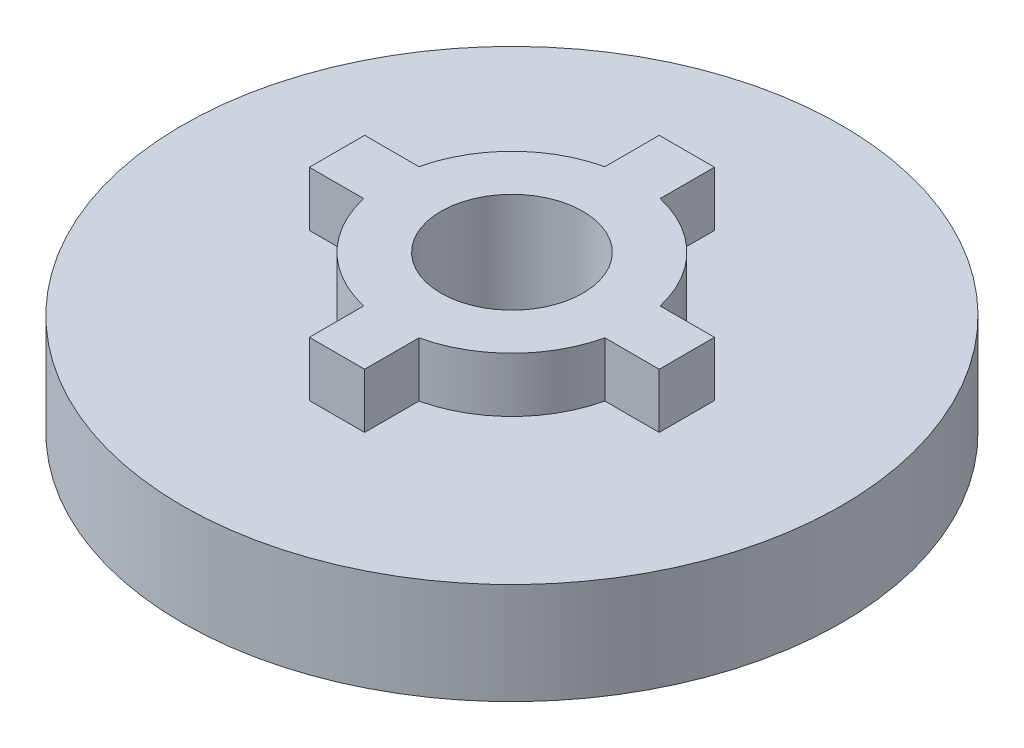
ISO-10303-21;
HEADER;
FILE_DESCRIPTION(('STEP AP214'),'2;1');
FILE_NAME('part.step','',(''),(''),'','','');
FILE_SCHEMA(('AUTOMOTIVE_DESIGN { 1 0 10303 214 1 1 1 1 }'));
ENDSEC;
DATA;
#1=APPLICATION_CONTEXT('core data for automotive mechanical design processes');
#2=APPLICATION_PROTOCOL_DEFINITION('international standard','automotive_design',2000,#1);
#3=PRODUCT_CONTEXT('',#1,'mechanical');
#4=PRODUCT('Part','Part','',(#3));
#5=PRODUCT_RELATED_PRODUCT_CATEGORY('part','',(#4));
#6=PRODUCT_DEFINITION_FORMATION('','',#4);
#7=PRODUCT_DEFINITION_CONTEXT('part definition',#1,'design');
#8=PRODUCT_DEFINITION('design','',#6,#7);
#9=PRODUCT_DEFINITION_SHAPE('','',#8);
#10=(LENGTH_UNIT() NAMED_UNIT(*) SI_UNIT(.MILLI.,.METRE.));
#11=(NAMED_UNIT(*) PLANE_ANGLE_UNIT() SI_UNIT($,.RADIAN.));
#12=(NAMED_UNIT(*) SI_UNIT($,.STERADIAN.) SOLID_ANGLE_UNIT());
#13=UNCERTAINTY_MEASURE_WITH_UNIT(LENGTH_MEASURE(1.E-05),#10,'distance_accuracy_value','');
#14=(GEOMETRIC_REPRESENTATION_CONTEXT(3) GLOBAL_UNCERTAINTY_ASSIGNED_CONTEXT((#13)) GLOBAL_UNIT_ASSIGNED_CONTEXT((#10,
#11,#12)) REPRESENTATION_CONTEXT('',''));
#15=CARTESIAN_POINT('',(0.,0.,0.));
#16=DIRECTION('',(0.,0.,1.));
#17=DIRECTION('',(1.,0.,0.));
#18=AXIS2_PLACEMENT_3D('',#15,#16,#17);
#19=CARTESIAN_POINT('',(0.,10.,0.));
#20=DIRECTION('',(0.,-1.,0.));
#21=DIRECTION('',(0.,0.,-1.));
#22=AXIS2_PLACEMENT_3D('',#19,#20,#21);
#23=CYLINDRICAL_SURFACE('',#22,32.5);
#24=CARTESIAN_POINT('',(0.,10.,0.));
#25=DIRECTION('',(0.,1.,0.));
#26=DIRECTION('',(0.,0.,1.));
#27=AXIS2_PLACEMENT_3D('',#24,#25,#26);
#28=CIRCLE('',#27,32.5);
#29=CARTESIAN_POINT('',(0.,10.,32.5));
#30=VERTEX_POINT('',#29);
#31=EDGE_CURVE('E11',#30,#30,#28,.T.);
#32=ORIENTED_EDGE('',*,*,#31,.F.);
#33=EDGE_LOOP('',(#32));
#34=FACE_BOUND('',#33,.T.);
#35=CARTESIAN_POINT('',(0.,0.,0.));
#36=DIRECTION('',(0.,1.,0.));
#37=DIRECTION('',(0.,0.,1.));
#38=AXIS2_PLACEMENT_3D('',#35,#36,#37);
#39=CIRCLE('',#38,32.5);
#40=CARTESIAN_POINT('',(0.,0.,32.5));
#41=VERTEX_POINT('',#40);
#42=EDGE_CURVE('E48',#41,#41,#39,.T.);
#43=ORIENTED_EDGE('',*,*,#42,.T.);
#44=EDGE_LOOP('',(#43));
#45=FACE_BOUND('',#44,.T.);
#46=ADVANCED_FACE('F45',(#34,#45),#23,.T.);
#47=CARTESIAN_POINT('',(0.,10.,0.));
#48=DIRECTION('',(0.,1.,0.));
#49=DIRECTION('',(0.,0.,1.));
#50=AXIS2_PLACEMENT_3D('',#47,#48,#49);
#51=PLANE('',#50);
#52=DIRECTION('',(1.,0.,0.));
#53=VECTOR('',#52,1.);
#54=CARTESIAN_POINT('',(11.8917776215333,10.,2.725));
#55=LINE('',#54,#53);
#56=CARTESIAN_POINT('',(11.8917776215333,10.,2.725));
#57=VERTEX_POINT('',#56);
#58=CARTESIAN_POINT('',(17.25,10.,2.725));
#59=VERTEX_POINT('',#58);
#60=EDGE_CURVE('E60',#57,#59,#55,.T.);
#61=ORIENTED_EDGE('',*,*,#60,.F.);
#62=CARTESIAN_POINT('',(0.,10.,0.));
#63=DIRECTION('',(0.,1.,0.));
#64=DIRECTION('',(0.,0.,1.));
#65=AXIS2_PLACEMENT_3D('',#62,#63,#64);
#66=CIRCLE('',#65,12.2);
#67=CARTESIAN_POINT('',(2.725,10.,11.8917776215333));
#68=VERTEX_POINT('',#67);
#69=EDGE_CURVE('E64',#68,#57,#66,.T.);
#70=ORIENTED_EDGE('',*,*,#69,.F.);
#71=DIRECTION('',(0.,0.,-1.));
#72=VECTOR('',#71,1.);
#73=CARTESIAN_POINT('',(2.725,10.,17.25));
#74=LINE('',#73,#72);
#75=CARTESIAN_POINT('',(2.725,10.,17.25));
#76=VERTEX_POINT('',#75);
#77=EDGE_CURVE('E244',#76,#68,#74,.T.);
#78=ORIENTED_EDGE('',*,*,#77,.F.);
#79=DIRECTION('',(1.,0.,0.));
#80=VECTOR('',#79,1.);
#81=CARTESIAN_POINT('',(-2.725,10.,17.25));
#82=LINE('',#81,#80);
#83=CARTESIAN_POINT('',(-2.725,10.,17.25));
#84=VERTEX_POINT('',#83);
#85=EDGE_CURVE('E247',#84,#76,#82,.T.);
#86=ORIENTED_EDGE('',*,*,#85,.F.);
#87=DIRECTION('',(0.,0.,1.));
#88=VECTOR('',#87,1.);
#89=CARTESIAN_POINT('',(-2.725,10.,17.25));
#90=LINE('',#89,#88);
#91=CARTESIAN_POINT('',(-2.725,10.,11.8917776215333));
#92=VERTEX_POINT('',#91);
#93=EDGE_CURVE('E251',#92,#84,#90,.T.);
#94=ORIENTED_EDGE('',*,*,#93,.F.);
#95=CARTESIAN_POINT('',(0.,10.,0.));
#96=DIRECTION('',(0.,1.,0.));
#97=DIRECTION('',(0.,0.,1.));
#98=AXIS2_PLACEMENT_3D('',#95,#96,#97);
#99=CIRCLE('',#98,12.2);
#100=CARTESIAN_POINT('',(-11.8917776215333,10.,2.725));
#101=VERTEX_POINT('',#100);
#102=EDGE_CURVE('E255',#101,#92,#99,.T.);
#103=ORIENTED_EDGE('',*,*,#102,.F.);
#104=DIRECTION('',(1.,0.,0.));
#105=VECTOR('',#104,1.);
#106=CARTESIAN_POINT('',(-17.25,10.,2.725));
#107=LINE('',#106,#105);
#108=CARTESIAN_POINT('',(-17.25,10.,2.725));
#109=VERTEX_POINT('',#108);
#110=EDGE_CURVE('E259',#109,#101,#107,.T.);
#111=ORIENTED_EDGE('',*,*,#110,.F.);
#112=DIRECTION('',(0.,0.,1.));
#113=VECTOR('',#112,1.);
#114=CARTESIAN_POINT('',(-17.25,10.,-2.725));
#115=LINE('',#114,#113);
#116=CARTESIAN_POINT('',(-17.25,10.,-2.725));
#117=VERTEX_POINT('',#116);
#118=EDGE_CURVE('E263',#117,#109,#115,.T.);
#119=ORIENTED_EDGE('',*,*,#118,.F.);
#120=DIRECTION('',(-1.,0.,0.));
#121=VECTOR('',#120,1.);
#122=CARTESIAN_POINT('',(-17.25,10.,-2.725));
#123=LINE('',#122,#121);
#124=CARTESIAN_POINT('',(-11.8917776215333,10.,-2.725));
#125=VERTEX_POINT('',#124);
#126=EDGE_CURVE('E267',#125,#117,#123,.T.);
#127=ORIENTED_EDGE('',*,*,#126,.F.);
#128=CARTESIAN_POINT('',(0.,10.,0.));
#129=DIRECTION('',(0.,1.,0.));
#130=DIRECTION('',(0.,0.,1.));
#131=AXIS2_PLACEMENT_3D('',#128,#129,#130);
#132=CIRCLE('',#131,12.2);
#133=CARTESIAN_POINT('',(-2.725,10.,-11.8917776215333));
#134=VERTEX_POINT('',#133);
#135=EDGE_CURVE('E271',#134,#125,#132,.T.);
#136=ORIENTED_EDGE('',*,*,#135,.F.);
#137=DIRECTION('',(0.,0.,1.));
#138=VECTOR('',#137,1.);
#139=CARTESIAN_POINT('',(-2.725,10.,-11.8917776215333));
#140=LINE('',#139,#138);
#141=CARTESIAN_POINT('',(-2.725,10.,-17.25));
#142=VERTEX_POINT('',#141);
#143=EDGE_CURVE('E275',#142,#134,#140,.T.);
#144=ORIENTED_EDGE('',*,*,#143,.F.);
#145=DIRECTION('',(-1.,0.,0.));
#146=VECTOR('',#145,1.);
#147=CARTESIAN_POINT('',(-2.725,10.,-17.25));
#148=LINE('',#147,#146);
#149=CARTESIAN_POINT('',(2.725,10.,-17.25));
#150=VERTEX_POINT('',#149);
#151=EDGE_CURVE('E279',#150,#142,#148,.T.);
#152=ORIENTED_EDGE('',*,*,#151,.F.);
#153=DIRECTION('',(0.,0.,-1.));
#154=VECTOR('',#153,1.);
#155=CARTESIAN_POINT('',(2.725,10.,-11.8917776215333));
#156=LINE('',#155,#154);
#157=CARTESIAN_POINT('',(2.725,10.,-11.8917776215333));
#158=VERTEX_POINT('',#157);
#159=EDGE_CURVE('E283',#158,#150,#156,.T.);
#160=ORIENTED_EDGE('',*,*,#159,.F.);
#161=CARTESIAN_POINT('',(0.,10.,0.));
#162=DIRECTION('',(0.,1.,0.));
#163=DIRECTION('',(0.,0.,1.));
#164=AXIS2_PLACEMENT_3D('',#161,#162,#163);
#165=CIRCLE('',#164,12.2);
#166=CARTESIAN_POINT('',(11.8917776215333,10.,-2.725));
#167=VERTEX_POINT('',#166);
#168=EDGE_CURVE('E287',#167,#158,#165,.T.);
#169=ORIENTED_EDGE('',*,*,#168,.F.);
#170=DIRECTION('',(-1.,0.,0.));
#171=VECTOR('',#170,1.);
#172=CARTESIAN_POINT('',(11.8917776215333,10.,-2.725));
#173=LINE('',#172,#171);
#174=CARTESIAN_POINT('',(17.25,10.,-2.725));
#175=VERTEX_POINT('',#174);
#176=EDGE_CURVE('E291',#175,#167,#173,.T.);
#177=ORIENTED_EDGE('',*,*,#176,.F.);
#178=DIRECTION('',(0.,0.,-1.));
#179=VECTOR('',#178,1.);
#180=CARTESIAN_POINT('',(17.25,10.,-2.725));
#181=LINE('',#180,#179);
#182=EDGE_CURVE('E295',#59,#175,#181,.T.);
#183=ORIENTED_EDGE('',*,*,#182,.F.);
#184=EDGE_LOOP('',(#61,#70,#78,#86,#94,#103,#111,#119,#127,#136,#144,#152,#160,#169,#177,#183));
#185=FACE_BOUND('',#184,.T.);
#186=ORIENTED_EDGE('',*,*,#31,.T.);
#187=EDGE_LOOP('',(#186));
#188=FACE_BOUND('',#187,.T.);
#189=ADVANCED_FACE('F369',(#185,#188),#51,.T.);
#190=CARTESIAN_POINT('',(0.,0.,0.));
#191=DIRECTION('',(0.,1.,0.));
#192=DIRECTION('',(0.,0.,1.));
#193=AXIS2_PLACEMENT_3D('',#190,#191,#192);
#194=PLANE('',#193);
#195=CARTESIAN_POINT('',(0.,0.,0.));
#196=DIRECTION('',(0.,1.,0.));
#197=DIRECTION('',(0.,0.,1.));
#198=AXIS2_PLACEMENT_3D('',#195,#196,#197);
#199=CIRCLE('',#198,7.);
#200=CARTESIAN_POINT('',(0.,0.,7.));
#201=VERTEX_POINT('',#200);
#202=EDGE_CURVE('E300',#201,#201,#199,.T.);
#203=ORIENTED_EDGE('',*,*,#202,.T.);
#204=EDGE_LOOP('',(#203));
#205=FACE_BOUND('',#204,.T.);
#206=ORIENTED_EDGE('',*,*,#42,.F.);
#207=EDGE_LOOP('',(#206));
#208=FACE_BOUND('',#207,.T.);
#209=ADVANCED_FACE('F349',(#205,#208),#194,.F.);
#210=CARTESIAN_POINT('',(11.8917776215333,15.4,2.725));
#211=DIRECTION('',(0.,0.,-1.));
#212=DIRECTION('',(-1.,0.,0.));
#213=AXIS2_PLACEMENT_3D('',#210,#211,#212);
#214=PLANE('',#213);
#215=ORIENTED_EDGE('',*,*,#60,.T.);
#216=DIRECTION('',(0.,-1.,0.));
#217=VECTOR('',#216,1.);
#218=CARTESIAN_POINT('',(17.25,15.4,2.725));
#219=LINE('',#218,#217);
#220=CARTESIAN_POINT('',(17.25,15.4,2.725));
#221=VERTEX_POINT('',#220);
#222=EDGE_CURVE('E161',#221,#59,#219,.T.);
#223=ORIENTED_EDGE('',*,*,#222,.F.);
#224=DIRECTION('',(1.,0.,0.));
#225=VECTOR('',#224,1.);
#226=CARTESIAN_POINT('',(11.8917776215333,15.4,2.725));
#227=LINE('',#226,#225);
#228=CARTESIAN_POINT('',(11.8917776215333,15.4,2.725));
#229=VERTEX_POINT('',#228);
#230=EDGE_CURVE('E168',#229,#221,#227,.T.);
#231=ORIENTED_EDGE('',*,*,#230,.F.);
#232=DIRECTION('',(0.,-1.,0.));
#233=VECTOR('',#232,1.);
#234=CARTESIAN_POINT('',(11.8917776215333,15.4,2.725));
#235=LINE('',#234,#233);
#236=EDGE_CURVE('E239',#229,#57,#235,.T.);
#237=ORIENTED_EDGE('',*,*,#236,.T.);
#238=EDGE_LOOP('',(#215,#223,#231,#237));
#239=FACE_BOUND('',#238,.T.);
#240=ADVANCED_FACE('F179',(#239),#214,.F.);
#241=CARTESIAN_POINT('',(17.25,15.4,-2.725));
#242=DIRECTION('',(-1.,0.,0.));
#243=DIRECTION('',(0.,0.,1.));
#244=AXIS2_PLACEMENT_3D('',#241,#242,#243);
#245=PLANE('',#244);
#246=ORIENTED_EDGE('',*,*,#182,.T.);
#247=DIRECTION('',(0.,-1.,0.));
#248=VECTOR('',#247,1.);
#249=CARTESIAN_POINT('',(17.25,15.4,-2.725));
#250=LINE('',#249,#248);
#251=CARTESIAN_POINT('',(17.25,15.4,-2.725));
#252=VERTEX_POINT('',#251);
#253=EDGE_CURVE('E163',#252,#175,#250,.T.);
#254=ORIENTED_EDGE('',*,*,#253,.F.);
#255=DIRECTION('',(0.,0.,-1.));
#256=VECTOR('',#255,1.);
#257=CARTESIAN_POINT('',(17.25,15.4,-2.725));
#258=LINE('',#257,#256);
#259=EDGE_CURVE('E156',#221,#252,#258,.T.);
#260=ORIENTED_EDGE('',*,*,#259,.F.);
#261=ORIENTED_EDGE('',*,*,#222,.T.);
#262=EDGE_LOOP('',(#246,#254,#260,#261));
#263=FACE_BOUND('',#262,.T.);
#264=ADVANCED_FACE('F159',(#263),#245,.F.);
#265=CARTESIAN_POINT('',(11.8917776215333,15.4,-2.725));
#266=DIRECTION('',(0.,0.,1.));
#267=DIRECTION('',(1.,0.,0.));
#268=AXIS2_PLACEMENT_3D('',#265,#266,#267);
#269=PLANE('',#268);
#270=ORIENTED_EDGE('',*,*,#176,.T.);
#271=DIRECTION('',(0.,-1.,0.));
#272=VECTOR('',#271,1.);
#273=CARTESIAN_POINT('',(11.8917776215333,15.4,-2.725));
#274=LINE('',#273,#272);
#275=CARTESIAN_POINT('',(11.8917776215333,15.4,-2.725));
#276=VERTEX_POINT('',#275);
#277=EDGE_CURVE('E185',#276,#167,#274,.T.);
#278=ORIENTED_EDGE('',*,*,#277,.F.);
#279=DIRECTION('',(-1.,0.,0.));
#280=VECTOR('',#279,1.);
#281=CARTESIAN_POINT('',(11.8917776215333,15.4,-2.725));
#282=LINE('',#281,#280);
#283=EDGE_CURVE('E167',#252,#276,#282,.T.);
#284=ORIENTED_EDGE('',*,*,#283,.F.);
#285=ORIENTED_EDGE('',*,*,#253,.T.);
#286=EDGE_LOOP('',(#270,#278,#284,#285));
#287=FACE_BOUND('',#286,.T.);
#288=ADVANCED_FACE('F385',(#287),#269,.F.);
#289=CARTESIAN_POINT('',(0.,15.4,0.));
#290=DIRECTION('',(0.,-1.,0.));
#291=DIRECTION('',(0.,0.,-1.));
#292=AXIS2_PLACEMENT_3D('',#289,#290,#291);
#293=CYLINDRICAL_SURFACE('',#292,12.2);
#294=ORIENTED_EDGE('',*,*,#168,.T.);
#295=DIRECTION('',(0.,-1.,0.));
#296=VECTOR('',#295,1.);
#297=CARTESIAN_POINT('',(2.725,15.4,-11.8917776215333));
#298=LINE('',#297,#296);
#299=CARTESIAN_POINT('',(2.725,15.4,-11.8917776215333));
#300=VERTEX_POINT('',#299);
#301=EDGE_CURVE('E191',#300,#158,#298,.T.);
#302=ORIENTED_EDGE('',*,*,#301,.F.);
#303=CARTESIAN_POINT('',(0.,15.4,0.));
#304=DIRECTION('',(0.,1.,0.));
#305=DIRECTION('',(0.,0.,1.));
#306=AXIS2_PLACEMENT_3D('',#303,#304,#305);
#307=CIRCLE('',#306,12.2);
#308=EDGE_CURVE('E336',#276,#300,#307,.T.);
#309=ORIENTED_EDGE('',*,*,#308,.F.);
#310=ORIENTED_EDGE('',*,*,#277,.T.);
#311=EDGE_LOOP('',(#294,#302,#309,#310));
#312=FACE_BOUND('',#311,.T.);
#313=ADVANCED_FACE('F388',(#312),#293,.T.);
#314=CARTESIAN_POINT('',(2.725,15.4,-11.8917776215333));
#315=DIRECTION('',(-1.,0.,0.));
#316=DIRECTION('',(0.,0.,1.));
#317=AXIS2_PLACEMENT_3D('',#314,#315,#316);
#318=PLANE('',#317);
#319=ORIENTED_EDGE('',*,*,#159,.T.);
#320=DIRECTION('',(0.,-1.,0.));
#321=VECTOR('',#320,1.);
#322=CARTESIAN_POINT('',(2.725,15.4,-17.25));
#323=LINE('',#322,#321);
#324=CARTESIAN_POINT('',(2.725,15.4,-17.25));
#325=VERTEX_POINT('',#324);
#326=EDGE_CURVE('E195',#325,#150,#323,.T.);
#327=ORIENTED_EDGE('',*,*,#326,.F.);
#328=DIRECTION('',(0.,0.,-1.));
#329=VECTOR('',#328,1.);
#330=CARTESIAN_POINT('',(2.725,15.4,-11.8917776215333));
#331=LINE('',#330,#329);
#332=EDGE_CURVE('E333',#300,#325,#331,.T.);
#333=ORIENTED_EDGE('',*,*,#332,.F.);
#334=ORIENTED_EDGE('',*,*,#301,.T.);
#335=EDGE_LOOP('',(#319,#327,#333,#334));
#336=FACE_BOUND('',#335,.T.);
#337=ADVANCED_FACE('F392',(#336),#318,.F.);
#338=CARTESIAN_POINT('',(-2.725,15.4,-17.25));
#339=DIRECTION('',(0.,0.,1.));
#340=DIRECTION('',(1.,0.,0.));
#341=AXIS2_PLACEMENT_3D('',#338,#339,#340);
#342=PLANE('',#341);
#343=ORIENTED_EDGE('',*,*,#151,.T.);
#344=DIRECTION('',(0.,-1.,0.));
#345=VECTOR('',#344,1.);
#346=CARTESIAN_POINT('',(-2.725,15.4,-17.25));
#347=LINE('',#346,#345);
#348=CARTESIAN_POINT('',(-2.725,15.4,-17.25));
#349=VERTEX_POINT('',#348);
#350=EDGE_CURVE('E199',#349,#142,#347,.T.);
#351=ORIENTED_EDGE('',*,*,#350,.F.);
#352=DIRECTION('',(-1.,0.,0.));
#353=VECTOR('',#352,1.);
#354=CARTESIAN_POINT('',(-2.725,15.4,-17.25));
#355=LINE('',#354,#353);
#356=EDGE_CURVE('E330',#325,#349,#355,.T.);
#357=ORIENTED_EDGE('',*,*,#356,.F.);
#358=ORIENTED_EDGE('',*,*,#326,.T.);
#359=EDGE_LOOP('',(#343,#351,#357,#358));
#360=FACE_BOUND('',#359,.T.);
#361=ADVANCED_FACE('F396',(#360),#342,.F.);
#362=CARTESIAN_POINT('',(-2.725,15.4,-11.8917776215333));
#363=DIRECTION('',(1.,0.,0.));
#364=DIRECTION('',(0.,0.,-1.));
#365=AXIS2_PLACEMENT_3D('',#362,#363,#364);
#366=PLANE('',#365);
#367=ORIENTED_EDGE('',*,*,#143,.T.);
#368=DIRECTION('',(0.,-1.,0.));
#369=VECTOR('',#368,1.);
#370=CARTESIAN_POINT('',(-2.725,15.4,-11.8917776215333));
#371=LINE('',#370,#369);
#372=CARTESIAN_POINT('',(-2.725,15.4,-11.8917776215333));
#373=VERTEX_POINT('',#372);
#374=EDGE_CURVE('E203',#373,#134,#371,.T.);
#375=ORIENTED_EDGE('',*,*,#374,.F.);
#376=DIRECTION('',(0.,0.,1.));
#377=VECTOR('',#376,1.);
#378=CARTESIAN_POINT('',(-2.725,15.4,-11.8917776215333));
#379=LINE('',#378,#377);
#380=EDGE_CURVE('E327',#349,#373,#379,.T.);
#381=ORIENTED_EDGE('',*,*,#380,.F.);
#382=ORIENTED_EDGE('',*,*,#350,.T.);
#383=EDGE_LOOP('',(#367,#375,#381,#382));
#384=FACE_BOUND('',#383,.T.);
#385=ADVANCED_FACE('F400',(#384),#366,.F.);
#386=CARTESIAN_POINT('',(0.,15.4,0.));
#387=DIRECTION('',(0.,-1.,0.));
#388=DIRECTION('',(0.,0.,-1.));
#389=AXIS2_PLACEMENT_3D('',#386,#387,#388);
#390=CYLINDRICAL_SURFACE('',#389,12.2);
#391=ORIENTED_EDGE('',*,*,#135,.T.);
#392=DIRECTION('',(0.,-1.,0.));
#393=VECTOR('',#392,1.);
#394=CARTESIAN_POINT('',(-11.8917776215333,15.4,-2.725));
#395=LINE('',#394,#393);
#396=CARTESIAN_POINT('',(-11.8917776215333,15.4,-2.725));
#397=VERTEX_POINT('',#396);
#398=EDGE_CURVE('E207',#397,#125,#395,.T.);
#399=ORIENTED_EDGE('',*,*,#398,.F.);
#400=CARTESIAN_POINT('',(0.,15.4,0.));
#401=DIRECTION('',(0.,1.,0.));
#402=DIRECTION('',(0.,0.,1.));
#403=AXIS2_PLACEMENT_3D('',#400,#401,#402);
#404=CIRCLE('',#403,12.2);
#405=EDGE_CURVE('E324',#373,#397,#404,.T.);
#406=ORIENTED_EDGE('',*,*,#405,.F.);
#407=ORIENTED_EDGE('',*,*,#374,.T.);
#408=EDGE_LOOP('',(#391,#399,#406,#407));
#409=FACE_BOUND('',#408,.T.);
#410=ADVANCED_FACE('F404',(#409),#390,.T.);
#411=CARTESIAN_POINT('',(-17.25,15.4,-2.725));
#412=DIRECTION('',(0.,0.,1.));
#413=DIRECTION('',(1.,0.,0.));
#414=AXIS2_PLACEMENT_3D('',#411,#412,#413);
#415=PLANE('',#414);
#416=ORIENTED_EDGE('',*,*,#126,.T.);
#417=DIRECTION('',(0.,-1.,0.));
#418=VECTOR('',#417,1.);
#419=CARTESIAN_POINT('',(-17.25,15.4,-2.725));
#420=LINE('',#419,#418);
#421=CARTESIAN_POINT('',(-17.25,15.4,-2.725));
#422=VERTEX_POINT('',#421);
#423=EDGE_CURVE('E211',#422,#117,#420,.T.);
#424=ORIENTED_EDGE('',*,*,#423,.F.);
#425=DIRECTION('',(-1.,0.,0.));
#426=VECTOR('',#425,1.);
#427=CARTESIAN_POINT('',(-17.25,15.4,-2.725));
#428=LINE('',#427,#426);
#429=EDGE_CURVE('E321',#397,#422,#428,.T.);
#430=ORIENTED_EDGE('',*,*,#429,.F.);
#431=ORIENTED_EDGE('',*,*,#398,.T.);
#432=EDGE_LOOP('',(#416,#424,#430,#431));
#433=FACE_BOUND('',#432,.T.);
#434=ADVANCED_FACE('F408',(#433),#415,.F.);
#435=CARTESIAN_POINT('',(-17.25,15.4,-2.725));
#436=DIRECTION('',(1.,0.,0.));
#437=DIRECTION('',(0.,0.,-1.));
#438=AXIS2_PLACEMENT_3D('',#435,#436,#437);
#439=PLANE('',#438);
#440=ORIENTED_EDGE('',*,*,#118,.T.);
#441=DIRECTION('',(0.,-1.,0.));
#442=VECTOR('',#441,1.);
#443=CARTESIAN_POINT('',(-17.25,15.4,2.725));
#444=LINE('',#443,#442);
#445=CARTESIAN_POINT('',(-17.25,15.4,2.725));
#446=VERTEX_POINT('',#445);
#447=EDGE_CURVE('E215',#446,#109,#444,.T.);
#448=ORIENTED_EDGE('',*,*,#447,.F.);
#449=DIRECTION('',(0.,0.,1.));
#450=VECTOR('',#449,1.);
#451=CARTESIAN_POINT('',(-17.25,15.4,-2.725));
#452=LINE('',#451,#450);
#453=EDGE_CURVE('E318',#422,#446,#452,.T.);
#454=ORIENTED_EDGE('',*,*,#453,.F.);
#455=ORIENTED_EDGE('',*,*,#423,.T.);
#456=EDGE_LOOP('',(#440,#448,#454,#455));
#457=FACE_BOUND('',#456,.T.);
#458=ADVANCED_FACE('F412',(#457),#439,.F.);
#459=CARTESIAN_POINT('',(-17.25,15.4,2.725));
#460=DIRECTION('',(0.,0.,-1.));
#461=DIRECTION('',(-1.,0.,0.));
#462=AXIS2_PLACEMENT_3D('',#459,#460,#461);
#463=PLANE('',#462);
#464=ORIENTED_EDGE('',*,*,#110,.T.);
#465=DIRECTION('',(0.,-1.,0.));
#466=VECTOR('',#465,1.);
#467=CARTESIAN_POINT('',(-11.8917776215333,15.4,2.725));
#468=LINE('',#467,#466);
#469=CARTESIAN_POINT('',(-11.8917776215333,15.4,2.725));
#470=VERTEX_POINT('',#469);
#471=EDGE_CURVE('E219',#470,#101,#468,.T.);
#472=ORIENTED_EDGE('',*,*,#471,.F.);
#473=DIRECTION('',(1.,0.,0.));
#474=VECTOR('',#473,1.);
#475=CARTESIAN_POINT('',(-17.25,15.4,2.725));
#476=LINE('',#475,#474);
#477=EDGE_CURVE('E315',#446,#470,#476,.T.);
#478=ORIENTED_EDGE('',*,*,#477,.F.);
#479=ORIENTED_EDGE('',*,*,#447,.T.);
#480=EDGE_LOOP('',(#464,#472,#478,#479));
#481=FACE_BOUND('',#480,.T.);
#482=ADVANCED_FACE('F416',(#481),#463,.F.);
#483=CARTESIAN_POINT('',(0.,15.4,0.));
#484=DIRECTION('',(0.,-1.,0.));
#485=DIRECTION('',(0.,0.,-1.));
#486=AXIS2_PLACEMENT_3D('',#483,#484,#485);
#487=CYLINDRICAL_SURFACE('',#486,12.2);
#488=ORIENTED_EDGE('',*,*,#102,.T.);
#489=DIRECTION('',(0.,-1.,0.));
#490=VECTOR('',#489,1.);
#491=CARTESIAN_POINT('',(-2.725,15.4,11.8917776215333));
#492=LINE('',#491,#490);
#493=CARTESIAN_POINT('',(-2.725,15.4,11.8917776215333));
#494=VERTEX_POINT('',#493);
#495=EDGE_CURVE('E223',#494,#92,#492,.T.);
#496=ORIENTED_EDGE('',*,*,#495,.F.);
#497=CARTESIAN_POINT('',(0.,15.4,0.));
#498=DIRECTION('',(0.,1.,0.));
#499=DIRECTION('',(0.,0.,1.));
#500=AXIS2_PLACEMENT_3D('',#497,#498,#499);
#501=CIRCLE('',#500,12.2);
#502=EDGE_CURVE('E312',#470,#494,#501,.T.);
#503=ORIENTED_EDGE('',*,*,#502,.F.);
#504=ORIENTED_EDGE('',*,*,#471,.T.);
#505=EDGE_LOOP('',(#488,#496,#503,#504));
#506=FACE_BOUND('',#505,.T.);
#507=ADVANCED_FACE('F420',(#506),#487,.T.);
#508=CARTESIAN_POINT('',(-2.725,15.4,17.25));
#509=DIRECTION('',(1.,0.,0.));
#510=DIRECTION('',(0.,0.,-1.));
#511=AXIS2_PLACEMENT_3D('',#508,#509,#510);
#512=PLANE('',#511);
#513=ORIENTED_EDGE('',*,*,#93,.T.);
#514=DIRECTION('',(0.,-1.,0.));
#515=VECTOR('',#514,1.);
#516=CARTESIAN_POINT('',(-2.725,15.4,17.25));
#517=LINE('',#516,#515);
#518=CARTESIAN_POINT('',(-2.725,15.4,17.25));
#519=VERTEX_POINT('',#518);
#520=EDGE_CURVE('E227',#519,#84,#517,.T.);
#521=ORIENTED_EDGE('',*,*,#520,.F.);
#522=DIRECTION('',(0.,0.,1.));
#523=VECTOR('',#522,1.);
#524=CARTESIAN_POINT('',(-2.725,15.4,17.25));
#525=LINE('',#524,#523);
#526=EDGE_CURVE('E309',#494,#519,#525,.T.);
#527=ORIENTED_EDGE('',*,*,#526,.F.);
#528=ORIENTED_EDGE('',*,*,#495,.T.);
#529=EDGE_LOOP('',(#513,#521,#527,#528));
#530=FACE_BOUND('',#529,.T.);
#531=ADVANCED_FACE('F424',(#530),#512,.F.);
#532=CARTESIAN_POINT('',(-2.725,15.4,17.25));
#533=DIRECTION('',(0.,0.,-1.));
#534=DIRECTION('',(-1.,0.,0.));
#535=AXIS2_PLACEMENT_3D('',#532,#533,#534);
#536=PLANE('',#535);
#537=ORIENTED_EDGE('',*,*,#85,.T.);
#538=DIRECTION('',(0.,-1.,0.));
#539=VECTOR('',#538,1.);
#540=CARTESIAN_POINT('',(2.725,15.4,17.25));
#541=LINE('',#540,#539);
#542=CARTESIAN_POINT('',(2.725,15.4,17.25));
#543=VERTEX_POINT('',#542);
#544=EDGE_CURVE('E231',#543,#76,#541,.T.);
#545=ORIENTED_EDGE('',*,*,#544,.F.);
#546=DIRECTION('',(1.,0.,0.));
#547=VECTOR('',#546,1.);
#548=CARTESIAN_POINT('',(-2.725,15.4,17.25));
#549=LINE('',#548,#547);
#550=EDGE_CURVE('E306',#519,#543,#549,.T.);
#551=ORIENTED_EDGE('',*,*,#550,.F.);
#552=ORIENTED_EDGE('',*,*,#520,.T.);
#553=EDGE_LOOP('',(#537,#545,#551,#552));
#554=FACE_BOUND('',#553,.T.);
#555=ADVANCED_FACE('F428',(#554),#536,.F.);
#556=CARTESIAN_POINT('',(2.725,15.4,17.25));
#557=DIRECTION('',(-1.,0.,0.));
#558=DIRECTION('',(0.,0.,1.));
#559=AXIS2_PLACEMENT_3D('',#556,#557,#558);
#560=PLANE('',#559);
#561=ORIENTED_EDGE('',*,*,#77,.T.);
#562=DIRECTION('',(0.,-1.,0.));
#563=VECTOR('',#562,1.);
#564=CARTESIAN_POINT('',(2.725,15.4,11.8917776215333));
#565=LINE('',#564,#563);
#566=CARTESIAN_POINT('',(2.725,15.4,11.8917776215333));
#567=VERTEX_POINT('',#566);
#568=EDGE_CURVE('E235',#567,#68,#565,.T.);
#569=ORIENTED_EDGE('',*,*,#568,.F.);
#570=DIRECTION('',(0.,0.,-1.));
#571=VECTOR('',#570,1.);
#572=CARTESIAN_POINT('',(2.725,15.4,17.25));
#573=LINE('',#572,#571);
#574=EDGE_CURVE('E303',#543,#567,#573,.T.);
#575=ORIENTED_EDGE('',*,*,#574,.F.);
#576=ORIENTED_EDGE('',*,*,#544,.T.);
#577=EDGE_LOOP('',(#561,#569,#575,#576));
#578=FACE_BOUND('',#577,.T.);
#579=ADVANCED_FACE('F365',(#578),#560,.F.);
#580=CARTESIAN_POINT('',(0.,15.4,0.));
#581=DIRECTION('',(0.,-1.,0.));
#582=DIRECTION('',(0.,0.,-1.));
#583=AXIS2_PLACEMENT_3D('',#580,#581,#582);
#584=CYLINDRICAL_SURFACE('',#583,12.2);
#585=ORIENTED_EDGE('',*,*,#69,.T.);
#586=ORIENTED_EDGE('',*,*,#236,.F.);
#587=CARTESIAN_POINT('',(0.,15.4,0.));
#588=DIRECTION('',(0.,1.,0.));
#589=DIRECTION('',(0.,0.,1.));
#590=AXIS2_PLACEMENT_3D('',#587,#588,#589);
#591=CIRCLE('',#590,12.2);
#592=EDGE_CURVE('E173',#567,#229,#591,.T.);
#593=ORIENTED_EDGE('',*,*,#592,.F.);
#594=ORIENTED_EDGE('',*,*,#568,.T.);
#595=EDGE_LOOP('',(#585,#586,#593,#594));
#596=FACE_BOUND('',#595,.T.);
#597=ADVANCED_FACE('F359',(#596),#584,.T.);
#598=CARTESIAN_POINT('',(0.,15.4,0.));
#599=DIRECTION('',(0.,1.,0.));
#600=DIRECTION('',(0.,0.,1.));
#601=AXIS2_PLACEMENT_3D('',#598,#599,#600);
#602=PLANE('',#601);
#603=CARTESIAN_POINT('',(0.,15.4,0.));
#604=DIRECTION('',(0.,1.,0.));
#605=DIRECTION('',(0.,0.,1.));
#606=AXIS2_PLACEMENT_3D('',#603,#604,#605);
#607=CIRCLE('',#606,7.);
#608=CARTESIAN_POINT('',(0.,15.4,7.));
#609=VERTEX_POINT('',#608);
#610=EDGE_CURVE('E341',#609,#609,#607,.T.);
#611=ORIENTED_EDGE('',*,*,#610,.F.);
#612=EDGE_LOOP('',(#611));
#613=FACE_BOUND('',#612,.T.);
#614=ORIENTED_EDGE('',*,*,#230,.T.);
#615=ORIENTED_EDGE('',*,*,#259,.T.);
#616=ORIENTED_EDGE('',*,*,#283,.T.);
#617=ORIENTED_EDGE('',*,*,#308,.T.);
#618=ORIENTED_EDGE('',*,*,#332,.T.);
#619=ORIENTED_EDGE('',*,*,#356,.T.);
#620=ORIENTED_EDGE('',*,*,#380,.T.);
#621=ORIENTED_EDGE('',*,*,#405,.T.);
#622=ORIENTED_EDGE('',*,*,#429,.T.);
#623=ORIENTED_EDGE('',*,*,#453,.T.);
#624=ORIENTED_EDGE('',*,*,#477,.T.);
#625=ORIENTED_EDGE('',*,*,#502,.T.);
#626=ORIENTED_EDGE('',*,*,#526,.T.);
#627=ORIENTED_EDGE('',*,*,#550,.T.);
#628=ORIENTED_EDGE('',*,*,#574,.T.);
#629=ORIENTED_EDGE('',*,*,#592,.T.);
#630=EDGE_LOOP('',(#614,#615,#616,#617,#618,#619,#620,#621,#622,#623,#624,#625,#626,#627,#628,#629));
#631=FACE_BOUND('',#630,.T.);
#632=ADVANCED_FACE('F171',(#613,#631),#602,.T.);
#633=CARTESIAN_POINT('',(0.,0.,0.));
#634=DIRECTION('',(0.,1.,0.));
#635=DIRECTION('',(0.,0.,1.));
#636=AXIS2_PLACEMENT_3D('',#633,#634,#635);
#637=CYLINDRICAL_SURFACE('',#636,7.);
#638=CARTESIAN_POINT('',(0.,0.,7.));
#639=CARTESIAN_POINT('',(0.,0.160416666666667,7.));
#640=CARTESIAN_POINT('',(0.,0.320833333333333,7.));
#641=CARTESIAN_POINT('',(0.,0.641666666666667,7.));
#642=CARTESIAN_POINT('',(0.,0.802083333333333,7.));
#643=CARTESIAN_POINT('',(0.,1.12291666666667,7.));
#644=CARTESIAN_POINT('',(0.,1.28333333333333,7.));
#645=CARTESIAN_POINT('',(0.,1.60416666666667,7.));
#646=CARTESIAN_POINT('',(0.,1.76458333333333,7.));
#647=CARTESIAN_POINT('',(0.,2.08541666666667,7.));
#648=CARTESIAN_POINT('',(0.,2.24583333333333,7.));
#649=CARTESIAN_POINT('',(0.,2.56666666666667,7.));
#650=CARTESIAN_POINT('',(0.,2.72708333333333,7.));
#651=CARTESIAN_POINT('',(0.,3.04791666666667,7.));
#652=CARTESIAN_POINT('',(0.,3.20833333333333,7.));
#653=CARTESIAN_POINT('',(0.,3.52916666666667,7.));
#654=CARTESIAN_POINT('',(0.,3.68958333333333,7.));
#655=CARTESIAN_POINT('',(0.,4.01041666666667,7.));
#656=CARTESIAN_POINT('',(0.,4.17083333333333,7.));
#657=CARTESIAN_POINT('',(0.,4.49166666666667,7.));
#658=CARTESIAN_POINT('',(0.,4.65208333333333,7.));
#659=CARTESIAN_POINT('',(0.,4.97291666666667,7.));
#660=CARTESIAN_POINT('',(0.,5.13333333333333,7.));
#661=CARTESIAN_POINT('',(0.,5.45416666666667,7.));
#662=CARTESIAN_POINT('',(0.,5.61458333333333,7.));
#663=CARTESIAN_POINT('',(0.,5.93541666666667,7.));
#664=CARTESIAN_POINT('',(0.,6.09583333333333,7.));
#665=CARTESIAN_POINT('',(0.,6.41666666666667,7.));
#666=CARTESIAN_POINT('',(0.,6.57708333333333,7.));
#667=CARTESIAN_POINT('',(0.,6.89791666666667,7.));
#668=CARTESIAN_POINT('',(0.,7.05833333333333,7.));
#669=CARTESIAN_POINT('',(0.,7.37916666666667,7.));
#670=CARTESIAN_POINT('',(0.,7.53958333333333,7.));
#671=CARTESIAN_POINT('',(0.,7.86041666666667,7.));
#672=CARTESIAN_POINT('',(0.,8.02083333333333,7.));
#673=CARTESIAN_POINT('',(0.,8.34166666666667,7.));
#674=CARTESIAN_POINT('',(0.,8.50208333333333,7.));
#675=CARTESIAN_POINT('',(0.,8.82291666666666,7.));
#676=CARTESIAN_POINT('',(0.,8.98333333333333,7.));
#677=CARTESIAN_POINT('',(0.,9.30416666666667,7.));
#678=CARTESIAN_POINT('',(0.,9.46458333333333,7.));
#679=CARTESIAN_POINT('',(0.,9.78541666666666,7.));
#680=CARTESIAN_POINT('',(0.,9.94583333333333,7.));
#681=CARTESIAN_POINT('',(0.,10.2666666666667,7.));
#682=CARTESIAN_POINT('',(0.,10.4270833333333,7.));
#683=CARTESIAN_POINT('',(0.,10.7479166666667,7.));
#684=CARTESIAN_POINT('',(0.,10.9083333333333,7.));
#685=CARTESIAN_POINT('',(0.,11.2291666666667,7.));
#686=CARTESIAN_POINT('',(0.,11.3895833333333,7.));
#687=CARTESIAN_POINT('',(0.,11.7104166666667,7.));
#688=CARTESIAN_POINT('',(0.,11.8708333333333,7.));
#689=CARTESIAN_POINT('',(0.,12.1916666666667,7.));
#690=CARTESIAN_POINT('',(0.,12.3520833333333,7.));
#691=CARTESIAN_POINT('',(0.,12.6729166666667,7.));
#692=CARTESIAN_POINT('',(0.,12.8333333333333,7.));
#693=CARTESIAN_POINT('',(0.,13.1541666666667,7.));
#694=CARTESIAN_POINT('',(0.,13.3145833333333,7.));
#695=CARTESIAN_POINT('',(0.,13.6354166666667,7.));
#696=CARTESIAN_POINT('',(0.,13.7958333333333,7.));
#697=CARTESIAN_POINT('',(0.,14.1166666666667,7.));
#698=CARTESIAN_POINT('',(0.,14.2770833333333,7.));
#699=CARTESIAN_POINT('',(0.,14.5979166666667,7.));
#700=CARTESIAN_POINT('',(0.,14.7583333333333,7.));
#701=CARTESIAN_POINT('',(0.,15.0791666666667,7.));
#702=CARTESIAN_POINT('',(0.,15.2395833333333,7.));
#703=CARTESIAN_POINT('',(0.,15.4,7.));
#704=B_SPLINE_CURVE_WITH_KNOTS('',3,(#638,#639,#640,#641,#642,#643,#644,#645,#646,#647,#648,
#649,#650,#651,#652,#653,#654,#655,#656,#657,#658,#659,#660,#661,#662,#663,#664,#665,#666,#667,
#668,#669,#670,#671,#672,#673,#674,#675,#676,#677,#678,#679,#680,#681,#682,#683,#684,#685,#686,
#687,#688,#689,#690,#691,#692,#693,#694,#695,#696,#697,#698,#699,#700,#701,#702,#703),
.UNSPECIFIED.,.F.,.F.,(4,2,2,2,2,2,2,2,2,2,2,2,2,2,2,2,2,2,2,2,2,2,2,2,2,2,2,2,2,2,2,2,4),(0.,
0.48125,0.9625,1.44375,1.925,2.40625,2.8875,3.36875,3.85,4.33125,4.8125,5.29375,5.775,6.25625,
6.7375,7.21875,7.7,8.18125,8.6625,9.14375,9.625,10.10625,10.5875,11.06875,11.55,12.03125,
12.5125,12.99375,13.475,13.95625,14.4375,14.91875,15.4),.UNSPECIFIED.);
#705=EDGE_CURVE('BSEAM352',#201,#609,#704,.T.);
#706=ORIENTED_EDGE('',*,*,#202,.F.);
#707=ORIENTED_EDGE('',*,*,#610,.T.);
#708=ORIENTED_EDGE('',*,*,#705,.T.);
#709=ORIENTED_EDGE('',*,*,#705,.F.);
#710=EDGE_LOOP('',(#706,#708,#707,#709));
#711=FACE_BOUND('',#710,.T.);
#712=ADVANCED_FACE('F352',(#711),#637,.F.);
#713=CLOSED_SHELL('',(#46,#189,#209,#240,#264,#288,#313,#337,#361,#385,#410,#434,#458,#482,#507,
#531,#555,#579,#597,#632,#712));
#714=MANIFOLD_SOLID_BREP('B2',#713);
#715=ADVANCED_BREP_SHAPE_REPRESENTATION('',(#18,#714),#14);
#716=SHAPE_DEFINITION_REPRESENTATION(#9,#715);
ENDSEC;
END-ISO-10303-21;
